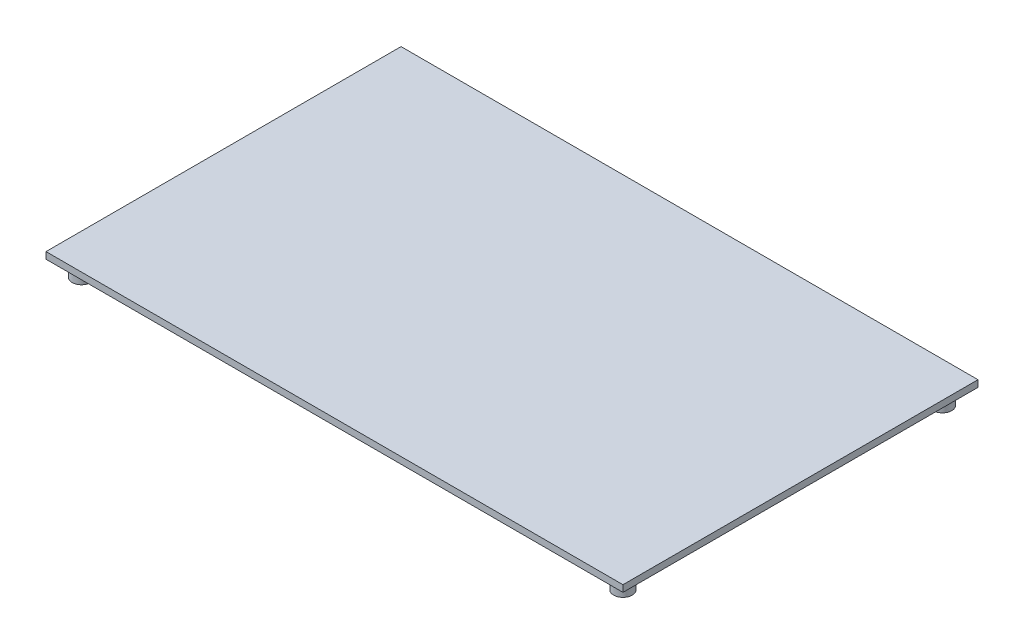
ISO-10303-21;
HEADER;
FILE_DESCRIPTION(('STEP AP214'),'2;1');
FILE_NAME('part.step','',(''),(''),'','','');
FILE_SCHEMA(('AUTOMOTIVE_DESIGN { 1 0 10303 214 1 1 1 1 }'));
ENDSEC;
DATA;
#1=APPLICATION_CONTEXT('core data for automotive mechanical design processes');
#2=APPLICATION_PROTOCOL_DEFINITION('international standard','automotive_design',2000,#1);
#3=PRODUCT_CONTEXT('',#1,'mechanical');
#4=PRODUCT('Part','Part','',(#3));
#5=PRODUCT_RELATED_PRODUCT_CATEGORY('part','',(#4));
#6=PRODUCT_DEFINITION_FORMATION('','',#4);
#7=PRODUCT_DEFINITION_CONTEXT('part definition',#1,'design');
#8=PRODUCT_DEFINITION('design','',#6,#7);
#9=PRODUCT_DEFINITION_SHAPE('','',#8);
#10=(LENGTH_UNIT() NAMED_UNIT(*) SI_UNIT(.MILLI.,.METRE.));
#11=(NAMED_UNIT(*) PLANE_ANGLE_UNIT() SI_UNIT($,.RADIAN.));
#12=(NAMED_UNIT(*) SI_UNIT($,.STERADIAN.) SOLID_ANGLE_UNIT());
#13=UNCERTAINTY_MEASURE_WITH_UNIT(LENGTH_MEASURE(1.E-05),#10,'distance_accuracy_value','');
#14=(GEOMETRIC_REPRESENTATION_CONTEXT(3) GLOBAL_UNCERTAINTY_ASSIGNED_CONTEXT((#13)) GLOBAL_UNIT_ASSIGNED_CONTEXT((#10,
#11,#12)) REPRESENTATION_CONTEXT('',''));
#15=CARTESIAN_POINT('',(0.,0.,0.));
#16=DIRECTION('',(0.,0.,1.));
#17=DIRECTION('',(1.,0.,0.));
#18=AXIS2_PLACEMENT_3D('',#15,#16,#17);
#19=CARTESIAN_POINT('',(0.,1.905,0.));
#20=DIRECTION('',(1.,0.,0.));
#21=DIRECTION('',(0.,0.,-1.));
#22=AXIS2_PLACEMENT_3D('',#19,#20,#21);
#23=PLANE('',#22);
#24=DIRECTION('',(0.,0.,1.));
#25=VECTOR('',#24,1.);
#26=CARTESIAN_POINT('',(0.,0.,0.));
#27=LINE('',#26,#25);
#28=CARTESIAN_POINT('',(0.,0.,-101.6));
#29=VERTEX_POINT('',#28);
#30=CARTESIAN_POINT('',(0.,0.,0.));
#31=VERTEX_POINT('',#30);
#32=EDGE_CURVE('E108',#29,#31,#27,.T.);
#33=ORIENTED_EDGE('',*,*,#32,.T.);
#34=DIRECTION('',(0.,-1.,0.));
#35=VECTOR('',#34,1.);
#36=CARTESIAN_POINT('',(0.,1.905,0.));
#37=LINE('',#36,#35);
#38=CARTESIAN_POINT('',(0.,1.905,0.));
#39=VERTEX_POINT('',#38);
#40=EDGE_CURVE('E11',#39,#31,#37,.T.);
#41=ORIENTED_EDGE('',*,*,#40,.F.);
#42=DIRECTION('',(0.,0.,1.));
#43=VECTOR('',#42,1.);
#44=CARTESIAN_POINT('',(0.,1.905,0.));
#45=LINE('',#44,#43);
#46=CARTESIAN_POINT('',(0.,1.905,-101.6));
#47=VERTEX_POINT('',#46);
#48=EDGE_CURVE('E96',#47,#39,#45,.T.);
#49=ORIENTED_EDGE('',*,*,#48,.F.);
#50=DIRECTION('',(0.,-1.,0.));
#51=VECTOR('',#50,1.);
#52=CARTESIAN_POINT('',(0.,1.905,-101.6));
#53=LINE('',#52,#51);
#54=EDGE_CURVE('E104',#47,#29,#53,.T.);
#55=ORIENTED_EDGE('',*,*,#54,.T.);
#56=EDGE_LOOP('',(#33,#41,#49,#55));
#57=FACE_BOUND('',#56,.T.);
#58=ADVANCED_FACE('F45',(#57),#23,.F.);
#59=CARTESIAN_POINT('',(0.,1.905,0.));
#60=DIRECTION('',(0.,0.,-1.));
#61=DIRECTION('',(-1.,0.,0.));
#62=AXIS2_PLACEMENT_3D('',#59,#60,#61);
#63=PLANE('',#62);
#64=DIRECTION('',(1.,0.,0.));
#65=VECTOR('',#64,1.);
#66=CARTESIAN_POINT('',(0.,0.,0.));
#67=LINE('',#66,#65);
#68=CARTESIAN_POINT('',(165.1,0.,0.));
#69=VERTEX_POINT('',#68);
#70=EDGE_CURVE('E100',#31,#69,#67,.T.);
#71=ORIENTED_EDGE('',*,*,#70,.T.);
#72=DIRECTION('',(0.,-1.,0.));
#73=VECTOR('',#72,1.);
#74=CARTESIAN_POINT('',(165.1,1.905,0.));
#75=LINE('',#74,#73);
#76=CARTESIAN_POINT('',(165.1,1.905,0.));
#77=VERTEX_POINT('',#76);
#78=EDGE_CURVE('E53',#77,#69,#75,.T.);
#79=ORIENTED_EDGE('',*,*,#78,.F.);
#80=DIRECTION('',(1.,0.,0.));
#81=VECTOR('',#80,1.);
#82=CARTESIAN_POINT('',(0.,1.905,0.));
#83=LINE('',#82,#81);
#84=EDGE_CURVE('E91',#39,#77,#83,.T.);
#85=ORIENTED_EDGE('',*,*,#84,.F.);
#86=ORIENTED_EDGE('',*,*,#40,.T.);
#87=EDGE_LOOP('',(#71,#79,#85,#86));
#88=FACE_BOUND('',#87,.T.);
#89=ADVANCED_FACE('F99',(#88),#63,.F.);
#90=CARTESIAN_POINT('',(165.1,1.905,0.));
#91=DIRECTION('',(-1.,0.,0.));
#92=DIRECTION('',(0.,0.,1.));
#93=AXIS2_PLACEMENT_3D('',#90,#91,#92);
#94=PLANE('',#93);
#95=DIRECTION('',(0.,0.,-1.));
#96=VECTOR('',#95,1.);
#97=CARTESIAN_POINT('',(165.1,0.,0.));
#98=LINE('',#97,#96);
#99=CARTESIAN_POINT('',(165.1,0.,-101.6));
#100=VERTEX_POINT('',#99);
#101=EDGE_CURVE('E78',#69,#100,#98,.T.);
#102=ORIENTED_EDGE('',*,*,#101,.T.);
#103=DIRECTION('',(0.,-1.,0.));
#104=VECTOR('',#103,1.);
#105=CARTESIAN_POINT('',(165.1,1.905,-101.6));
#106=LINE('',#105,#104);
#107=CARTESIAN_POINT('',(165.1,1.905,-101.6));
#108=VERTEX_POINT('',#107);
#109=EDGE_CURVE('E101',#108,#100,#106,.T.);
#110=ORIENTED_EDGE('',*,*,#109,.F.);
#111=DIRECTION('',(0.,0.,-1.));
#112=VECTOR('',#111,1.);
#113=CARTESIAN_POINT('',(165.1,1.905,0.));
#114=LINE('',#113,#112);
#115=EDGE_CURVE('E94',#77,#108,#114,.T.);
#116=ORIENTED_EDGE('',*,*,#115,.F.);
#117=ORIENTED_EDGE('',*,*,#78,.T.);
#118=EDGE_LOOP('',(#102,#110,#116,#117));
#119=FACE_BOUND('',#118,.T.);
#120=ADVANCED_FACE('F102',(#119),#94,.F.);
#121=CARTESIAN_POINT('',(0.,1.905,-101.6));
#122=DIRECTION('',(0.,0.,1.));
#123=DIRECTION('',(1.,0.,0.));
#124=AXIS2_PLACEMENT_3D('',#121,#122,#123);
#125=PLANE('',#124);
#126=DIRECTION('',(-1.,0.,0.));
#127=VECTOR('',#126,1.);
#128=CARTESIAN_POINT('',(0.,0.,-101.6));
#129=LINE('',#128,#127);
#130=EDGE_CURVE('E84',#100,#29,#129,.T.);
#131=ORIENTED_EDGE('',*,*,#130,.T.);
#132=ORIENTED_EDGE('',*,*,#54,.F.);
#133=DIRECTION('',(-1.,0.,0.));
#134=VECTOR('',#133,1.);
#135=CARTESIAN_POINT('',(0.,1.905,-101.6));
#136=LINE('',#135,#134);
#137=EDGE_CURVE('E61',#108,#47,#136,.T.);
#138=ORIENTED_EDGE('',*,*,#137,.F.);
#139=ORIENTED_EDGE('',*,*,#109,.T.);
#140=EDGE_LOOP('',(#131,#132,#138,#139));
#141=FACE_BOUND('',#140,.T.);
#142=ADVANCED_FACE('F116',(#141),#125,.F.);
#143=CARTESIAN_POINT('',(0.,1.905,0.));
#144=DIRECTION('',(0.,-1.,0.));
#145=DIRECTION('',(0.,0.,-1.));
#146=AXIS2_PLACEMENT_3D('',#143,#144,#145);
#147=PLANE('',#146);
#148=ORIENTED_EDGE('',*,*,#48,.T.);
#149=ORIENTED_EDGE('',*,*,#84,.T.);
#150=ORIENTED_EDGE('',*,*,#115,.T.);
#151=ORIENTED_EDGE('',*,*,#137,.T.);
#152=EDGE_LOOP('',(#148,#149,#150,#151));
#153=FACE_BOUND('',#152,.T.);
#154=ADVANCED_FACE('F92',(#153),#147,.F.);
#155=CARTESIAN_POINT('',(0.,0.,0.));
#156=DIRECTION('',(0.,-1.,0.));
#157=DIRECTION('',(0.,0.,-1.));
#158=AXIS2_PLACEMENT_3D('',#155,#156,#157);
#159=PLANE('',#158);
#160=CARTESIAN_POINT('',(118.11,0.,-34.925));
#161=DIRECTION('',(0.,-1.,0.));
#162=DIRECTION('',(0.,0.,-1.));
#163=AXIS2_PLACEMENT_3D('',#160,#161,#162);
#164=CIRCLE('',#163,2.667);
#165=CARTESIAN_POINT('',(118.11,0.,-37.592));
#166=VERTEX_POINT('',#165);
#167=EDGE_CURVE('E161',#166,#166,#164,.T.);
#168=ORIENTED_EDGE('',*,*,#167,.F.);
#169=EDGE_LOOP('',(#168));
#170=FACE_BOUND('',#169,.T.);
#171=CARTESIAN_POINT('',(60.325,0.,-34.925));
#172=DIRECTION('',(0.,-1.,0.));
#173=DIRECTION('',(0.,0.,-1.));
#174=AXIS2_PLACEMENT_3D('',#171,#172,#173);
#175=CIRCLE('',#174,2.66699999999999);
#176=CARTESIAN_POINT('',(60.325,0.,-37.592));
#177=VERTEX_POINT('',#176);
#178=EDGE_CURVE('E155',#177,#177,#175,.T.);
#179=ORIENTED_EDGE('',*,*,#178,.F.);
#180=EDGE_LOOP('',(#179));
#181=FACE_BOUND('',#180,.T.);
#182=CARTESIAN_POINT('',(60.325,0.,-83.82));
#183=DIRECTION('',(0.,-1.,0.));
#184=DIRECTION('',(0.,0.,-1.));
#185=AXIS2_PLACEMENT_3D('',#182,#183,#184);
#186=CIRCLE('',#185,2.66699999999999);
#187=CARTESIAN_POINT('',(60.325,0.,-86.487));
#188=VERTEX_POINT('',#187);
#189=EDGE_CURVE('E149',#188,#188,#186,.T.);
#190=ORIENTED_EDGE('',*,*,#189,.F.);
#191=EDGE_LOOP('',(#190));
#192=FACE_BOUND('',#191,.T.);
#193=CARTESIAN_POINT('',(118.11,0.,-83.82));
#194=DIRECTION('',(0.,-1.,0.));
#195=DIRECTION('',(0.,0.,-1.));
#196=AXIS2_PLACEMENT_3D('',#193,#194,#195);
#197=CIRCLE('',#196,2.667);
#198=CARTESIAN_POINT('',(118.11,0.,-86.487));
#199=VERTEX_POINT('',#198);
#200=EDGE_CURVE('E143',#199,#199,#197,.T.);
#201=ORIENTED_EDGE('',*,*,#200,.F.);
#202=EDGE_LOOP('',(#201));
#203=FACE_BOUND('',#202,.T.);
#204=CARTESIAN_POINT('',(160.02,0.,-96.52));
#205=DIRECTION('',(0.,-1.,0.));
#206=DIRECTION('',(0.,0.,-1.));
#207=AXIS2_PLACEMENT_3D('',#204,#205,#206);
#208=CIRCLE('',#207,2.667);
#209=CARTESIAN_POINT('',(160.02,0.,-99.187));
#210=VERTEX_POINT('',#209);
#211=EDGE_CURVE('E137',#210,#210,#208,.T.);
#212=ORIENTED_EDGE('',*,*,#211,.F.);
#213=EDGE_LOOP('',(#212));
#214=FACE_BOUND('',#213,.T.);
#215=CARTESIAN_POINT('',(160.02,0.,-5.08));
#216=DIRECTION('',(0.,-1.,0.));
#217=DIRECTION('',(0.,0.,-1.));
#218=AXIS2_PLACEMENT_3D('',#215,#216,#217);
#219=CIRCLE('',#218,2.667);
#220=CARTESIAN_POINT('',(160.02,0.,-7.747));
#221=VERTEX_POINT('',#220);
#222=EDGE_CURVE('E131',#221,#221,#219,.T.);
#223=ORIENTED_EDGE('',*,*,#222,.F.);
#224=EDGE_LOOP('',(#223));
#225=FACE_BOUND('',#224,.T.);
#226=CARTESIAN_POINT('',(5.08,0.,-5.08));
#227=DIRECTION('',(0.,-1.,0.));
#228=DIRECTION('',(0.,0.,-1.));
#229=AXIS2_PLACEMENT_3D('',#226,#227,#228);
#230=CIRCLE('',#229,2.667);
#231=CARTESIAN_POINT('',(5.08,0.,-7.747));
#232=VERTEX_POINT('',#231);
#233=EDGE_CURVE('E125',#232,#232,#230,.T.);
#234=ORIENTED_EDGE('',*,*,#233,.F.);
#235=EDGE_LOOP('',(#234));
#236=FACE_BOUND('',#235,.T.);
#237=CARTESIAN_POINT('',(5.08,0.,-96.52));
#238=DIRECTION('',(0.,-1.,0.));
#239=DIRECTION('',(0.,0.,-1.));
#240=AXIS2_PLACEMENT_3D('',#237,#238,#239);
#241=CIRCLE('',#240,2.66700000000001);
#242=CARTESIAN_POINT('',(5.08,0.,-99.187));
#243=VERTEX_POINT('',#242);
#244=EDGE_CURVE('E122',#243,#243,#241,.T.);
#245=ORIENTED_EDGE('',*,*,#244,.F.);
#246=EDGE_LOOP('',(#245));
#247=FACE_BOUND('',#246,.T.);
#248=ORIENTED_EDGE('',*,*,#32,.F.);
#249=ORIENTED_EDGE('',*,*,#130,.F.);
#250=ORIENTED_EDGE('',*,*,#101,.F.);
#251=ORIENTED_EDGE('',*,*,#70,.F.);
#252=EDGE_LOOP('',(#248,#249,#250,#251));
#253=FACE_BOUND('',#252,.T.);
#254=ADVANCED_FACE('F119',(#170,#181,#192,#203,#214,#225,#236,#247,#253),#159,.T.);
#255=CARTESIAN_POINT('',(5.08,-4.445,-96.52));
#256=DIRECTION('',(0.,1.,0.));
#257=DIRECTION('',(0.,0.,1.));
#258=AXIS2_PLACEMENT_3D('',#255,#256,#257);
#259=CYLINDRICAL_SURFACE('',#258,2.66700000000001);
#260=CARTESIAN_POINT('',(5.08,-4.445,-96.52));
#261=DIRECTION('',(0.,-1.,0.));
#262=DIRECTION('',(0.,0.,-1.));
#263=AXIS2_PLACEMENT_3D('',#260,#261,#262);
#264=CIRCLE('',#263,2.66700000000001);
#265=CARTESIAN_POINT('',(5.08,-4.445,-99.187));
#266=VERTEX_POINT('',#265);
#267=EDGE_CURVE('E111',#266,#266,#264,.T.);
#268=ORIENTED_EDGE('',*,*,#267,.F.);
#269=EDGE_LOOP('',(#268));
#270=FACE_BOUND('',#269,.T.);
#271=ORIENTED_EDGE('',*,*,#244,.T.);
#272=EDGE_LOOP('',(#271));
#273=FACE_BOUND('',#272,.T.);
#274=ADVANCED_FACE('F174',(#270,#273),#259,.T.);
#275=CARTESIAN_POINT('',(5.08,-4.445,-96.52));
#276=DIRECTION('',(0.,-1.,0.));
#277=DIRECTION('',(0.,0.,-1.));
#278=AXIS2_PLACEMENT_3D('',#275,#276,#277);
#279=PLANE('',#278);
#280=ORIENTED_EDGE('',*,*,#267,.T.);
#281=EDGE_LOOP('',(#280));
#282=FACE_BOUND('',#281,.T.);
#283=ADVANCED_FACE('F191',(#282),#279,.T.);
#284=CARTESIAN_POINT('',(5.08,-4.445,-5.08));
#285=DIRECTION('',(0.,1.,0.));
#286=DIRECTION('',(0.,0.,1.));
#287=AXIS2_PLACEMENT_3D('',#284,#285,#286);
#288=CYLINDRICAL_SURFACE('',#287,2.667);
#289=CARTESIAN_POINT('',(5.08,-4.445,-5.08));
#290=DIRECTION('',(0.,-1.,0.));
#291=DIRECTION('',(0.,0.,-1.));
#292=AXIS2_PLACEMENT_3D('',#289,#290,#291);
#293=CIRCLE('',#292,2.667);
#294=CARTESIAN_POINT('',(5.08,-4.445,-7.747));
#295=VERTEX_POINT('',#294);
#296=EDGE_CURVE('E128',#295,#295,#293,.T.);
#297=ORIENTED_EDGE('',*,*,#296,.F.);
#298=EDGE_LOOP('',(#297));
#299=FACE_BOUND('',#298,.T.);
#300=ORIENTED_EDGE('',*,*,#233,.T.);
#301=EDGE_LOOP('',(#300));
#302=FACE_BOUND('',#301,.T.);
#303=ADVANCED_FACE('F197',(#299,#302),#288,.T.);
#304=CARTESIAN_POINT('',(5.08,-4.445,-5.08));
#305=DIRECTION('',(0.,-1.,0.));
#306=DIRECTION('',(0.,0.,-1.));
#307=AXIS2_PLACEMENT_3D('',#304,#305,#306);
#308=PLANE('',#307);
#309=ORIENTED_EDGE('',*,*,#296,.T.);
#310=EDGE_LOOP('',(#309));
#311=FACE_BOUND('',#310,.T.);
#312=ADVANCED_FACE('F248',(#311),#308,.T.);
#313=CARTESIAN_POINT('',(160.02,-4.445,-5.08));
#314=DIRECTION('',(0.,1.,0.));
#315=DIRECTION('',(0.,0.,1.));
#316=AXIS2_PLACEMENT_3D('',#313,#314,#315);
#317=CYLINDRICAL_SURFACE('',#316,2.667);
#318=CARTESIAN_POINT('',(160.02,-4.445,-5.08));
#319=DIRECTION('',(0.,-1.,0.));
#320=DIRECTION('',(0.,0.,-1.));
#321=AXIS2_PLACEMENT_3D('',#318,#319,#320);
#322=CIRCLE('',#321,2.667);
#323=CARTESIAN_POINT('',(160.02,-4.445,-7.747));
#324=VERTEX_POINT('',#323);
#325=EDGE_CURVE('E134',#324,#324,#322,.T.);
#326=ORIENTED_EDGE('',*,*,#325,.F.);
#327=EDGE_LOOP('',(#326));
#328=FACE_BOUND('',#327,.T.);
#329=ORIENTED_EDGE('',*,*,#222,.T.);
#330=EDGE_LOOP('',(#329));
#331=FACE_BOUND('',#330,.T.);
#332=ADVANCED_FACE('F258',(#328,#331),#317,.T.);
#333=CARTESIAN_POINT('',(160.02,-4.445,-5.08));
#334=DIRECTION('',(0.,-1.,0.));
#335=DIRECTION('',(0.,0.,-1.));
#336=AXIS2_PLACEMENT_3D('',#333,#334,#335);
#337=PLANE('',#336);
#338=ORIENTED_EDGE('',*,*,#325,.T.);
#339=EDGE_LOOP('',(#338));
#340=FACE_BOUND('',#339,.T.);
#341=ADVANCED_FACE('F268',(#340),#337,.T.);
#342=CARTESIAN_POINT('',(160.02,-4.445,-96.52));
#343=DIRECTION('',(0.,1.,0.));
#344=DIRECTION('',(0.,0.,1.));
#345=AXIS2_PLACEMENT_3D('',#342,#343,#344);
#346=CYLINDRICAL_SURFACE('',#345,2.667);
#347=CARTESIAN_POINT('',(160.02,-4.445,-96.52));
#348=DIRECTION('',(0.,-1.,0.));
#349=DIRECTION('',(0.,0.,-1.));
#350=AXIS2_PLACEMENT_3D('',#347,#348,#349);
#351=CIRCLE('',#350,2.667);
#352=CARTESIAN_POINT('',(160.02,-4.445,-99.187));
#353=VERTEX_POINT('',#352);
#354=EDGE_CURVE('E140',#353,#353,#351,.T.);
#355=ORIENTED_EDGE('',*,*,#354,.F.);
#356=EDGE_LOOP('',(#355));
#357=FACE_BOUND('',#356,.T.);
#358=ORIENTED_EDGE('',*,*,#211,.T.);
#359=EDGE_LOOP('',(#358));
#360=FACE_BOUND('',#359,.T.);
#361=ADVANCED_FACE('F278',(#357,#360),#346,.T.);
#362=CARTESIAN_POINT('',(160.02,-4.445,-96.52));
#363=DIRECTION('',(0.,-1.,0.));
#364=DIRECTION('',(0.,0.,-1.));
#365=AXIS2_PLACEMENT_3D('',#362,#363,#364);
#366=PLANE('',#365);
#367=ORIENTED_EDGE('',*,*,#354,.T.);
#368=EDGE_LOOP('',(#367));
#369=FACE_BOUND('',#368,.T.);
#370=ADVANCED_FACE('F288',(#369),#366,.T.);
#371=CARTESIAN_POINT('',(118.11,-4.445,-83.82));
#372=DIRECTION('',(0.,1.,0.));
#373=DIRECTION('',(0.,0.,1.));
#374=AXIS2_PLACEMENT_3D('',#371,#372,#373);
#375=CYLINDRICAL_SURFACE('',#374,2.667);
#376=CARTESIAN_POINT('',(118.11,-4.445,-83.82));
#377=DIRECTION('',(0.,-1.,0.));
#378=DIRECTION('',(0.,0.,-1.));
#379=AXIS2_PLACEMENT_3D('',#376,#377,#378);
#380=CIRCLE('',#379,2.667);
#381=CARTESIAN_POINT('',(118.11,-4.445,-86.487));
#382=VERTEX_POINT('',#381);
#383=EDGE_CURVE('E146',#382,#382,#380,.T.);
#384=ORIENTED_EDGE('',*,*,#383,.F.);
#385=EDGE_LOOP('',(#384));
#386=FACE_BOUND('',#385,.T.);
#387=ORIENTED_EDGE('',*,*,#200,.T.);
#388=EDGE_LOOP('',(#387));
#389=FACE_BOUND('',#388,.T.);
#390=ADVANCED_FACE('F298',(#386,#389),#375,.T.);
#391=CARTESIAN_POINT('',(118.11,-4.445,-83.82));
#392=DIRECTION('',(0.,-1.,0.));
#393=DIRECTION('',(0.,0.,-1.));
#394=AXIS2_PLACEMENT_3D('',#391,#392,#393);
#395=PLANE('',#394);
#396=ORIENTED_EDGE('',*,*,#383,.T.);
#397=EDGE_LOOP('',(#396));
#398=FACE_BOUND('',#397,.T.);
#399=ADVANCED_FACE('F308',(#398),#395,.T.);
#400=CARTESIAN_POINT('',(60.325,-4.445,-83.82));
#401=DIRECTION('',(0.,1.,0.));
#402=DIRECTION('',(0.,0.,1.));
#403=AXIS2_PLACEMENT_3D('',#400,#401,#402);
#404=CYLINDRICAL_SURFACE('',#403,2.66699999999999);
#405=CARTESIAN_POINT('',(60.325,-4.445,-83.82));
#406=DIRECTION('',(0.,-1.,0.));
#407=DIRECTION('',(0.,0.,-1.));
#408=AXIS2_PLACEMENT_3D('',#405,#406,#407);
#409=CIRCLE('',#408,2.66699999999999);
#410=CARTESIAN_POINT('',(60.325,-4.445,-86.487));
#411=VERTEX_POINT('',#410);
#412=EDGE_CURVE('E152',#411,#411,#409,.T.);
#413=ORIENTED_EDGE('',*,*,#412,.F.);
#414=EDGE_LOOP('',(#413));
#415=FACE_BOUND('',#414,.T.);
#416=ORIENTED_EDGE('',*,*,#189,.T.);
#417=EDGE_LOOP('',(#416));
#418=FACE_BOUND('',#417,.T.);
#419=ADVANCED_FACE('F318',(#415,#418),#404,.T.);
#420=CARTESIAN_POINT('',(60.325,-4.445,-83.82));
#421=DIRECTION('',(0.,-1.,0.));
#422=DIRECTION('',(0.,0.,-1.));
#423=AXIS2_PLACEMENT_3D('',#420,#421,#422);
#424=PLANE('',#423);
#425=ORIENTED_EDGE('',*,*,#412,.T.);
#426=EDGE_LOOP('',(#425));
#427=FACE_BOUND('',#426,.T.);
#428=ADVANCED_FACE('F328',(#427),#424,.T.);
#429=CARTESIAN_POINT('',(60.325,-4.445,-34.925));
#430=DIRECTION('',(0.,1.,0.));
#431=DIRECTION('',(0.,0.,1.));
#432=AXIS2_PLACEMENT_3D('',#429,#430,#431);
#433=CYLINDRICAL_SURFACE('',#432,2.66699999999999);
#434=CARTESIAN_POINT('',(60.325,-4.445,-34.925));
#435=DIRECTION('',(0.,-1.,0.));
#436=DIRECTION('',(0.,0.,-1.));
#437=AXIS2_PLACEMENT_3D('',#434,#435,#436);
#438=CIRCLE('',#437,2.66699999999999);
#439=CARTESIAN_POINT('',(60.325,-4.445,-37.592));
#440=VERTEX_POINT('',#439);
#441=EDGE_CURVE('E158',#440,#440,#438,.T.);
#442=ORIENTED_EDGE('',*,*,#441,.F.);
#443=EDGE_LOOP('',(#442));
#444=FACE_BOUND('',#443,.T.);
#445=ORIENTED_EDGE('',*,*,#178,.T.);
#446=EDGE_LOOP('',(#445));
#447=FACE_BOUND('',#446,.T.);
#448=ADVANCED_FACE('F338',(#444,#447),#433,.T.);
#449=CARTESIAN_POINT('',(60.325,-4.445,-34.925));
#450=DIRECTION('',(0.,-1.,0.));
#451=DIRECTION('',(0.,0.,-1.));
#452=AXIS2_PLACEMENT_3D('',#449,#450,#451);
#453=PLANE('',#452);
#454=ORIENTED_EDGE('',*,*,#441,.T.);
#455=EDGE_LOOP('',(#454));
#456=FACE_BOUND('',#455,.T.);
#457=ADVANCED_FACE('F348',(#456),#453,.T.);
#458=CARTESIAN_POINT('',(118.11,-4.445,-34.925));
#459=DIRECTION('',(0.,1.,0.));
#460=DIRECTION('',(0.,0.,1.));
#461=AXIS2_PLACEMENT_3D('',#458,#459,#460);
#462=CYLINDRICAL_SURFACE('',#461,2.667);
#463=CARTESIAN_POINT('',(118.11,-4.445,-34.925));
#464=DIRECTION('',(0.,-1.,0.));
#465=DIRECTION('',(0.,0.,-1.));
#466=AXIS2_PLACEMENT_3D('',#463,#464,#465);
#467=CIRCLE('',#466,2.667);
#468=CARTESIAN_POINT('',(118.11,-4.445,-37.592));
#469=VERTEX_POINT('',#468);
#470=EDGE_CURVE('E164',#469,#469,#467,.T.);
#471=ORIENTED_EDGE('',*,*,#470,.F.);
#472=EDGE_LOOP('',(#471));
#473=FACE_BOUND('',#472,.T.);
#474=ORIENTED_EDGE('',*,*,#167,.T.);
#475=EDGE_LOOP('',(#474));
#476=FACE_BOUND('',#475,.T.);
#477=ADVANCED_FACE('F170',(#473,#476),#462,.T.);
#478=CARTESIAN_POINT('',(118.11,-4.445,-34.925));
#479=DIRECTION('',(0.,-1.,0.));
#480=DIRECTION('',(0.,0.,-1.));
#481=AXIS2_PLACEMENT_3D('',#478,#479,#480);
#482=PLANE('',#481);
#483=ORIENTED_EDGE('',*,*,#470,.T.);
#484=EDGE_LOOP('',(#483));
#485=FACE_BOUND('',#484,.T.);
#486=ADVANCED_FACE('F367',(#485),#482,.T.);
#487=CLOSED_SHELL('',(#58,#89,#120,#142,#154,#254,#274,#283,#303,#312,#332,#341,#361,#370,#390,
#399,#419,#428,#448,#457,#477,#486));
#488=MANIFOLD_SOLID_BREP('B2',#487);
#489=ADVANCED_BREP_SHAPE_REPRESENTATION('',(#18,#488),#14);
#490=SHAPE_DEFINITION_REPRESENTATION(#9,#489);
ENDSEC;
END-ISO-10303-21;
